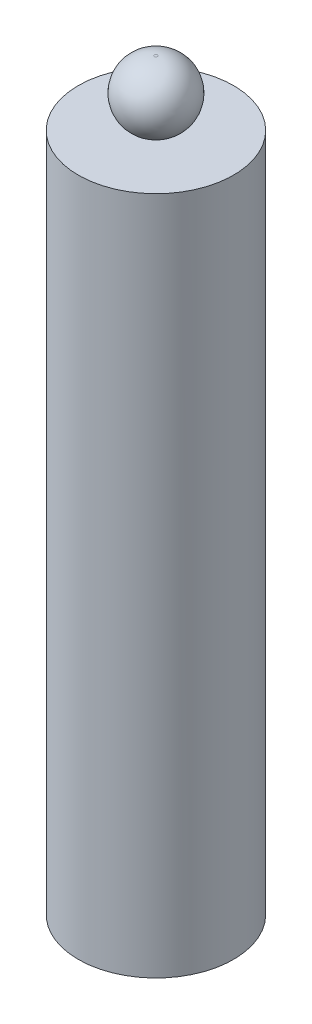
ISO-10303-21;
HEADER;
FILE_DESCRIPTION(('STEP AP214'),'2;1');
FILE_NAME('part.step','',(''),(''),'','','');
FILE_SCHEMA(('AUTOMOTIVE_DESIGN { 1 0 10303 214 1 1 1 1 }'));
ENDSEC;
DATA;
#1=APPLICATION_CONTEXT('core data for automotive mechanical design processes');
#2=APPLICATION_PROTOCOL_DEFINITION('international standard','automotive_design',2000,#1);
#3=PRODUCT_CONTEXT('',#1,'mechanical');
#4=PRODUCT('Part','Part','',(#3));
#5=PRODUCT_RELATED_PRODUCT_CATEGORY('part','',(#4));
#6=PRODUCT_DEFINITION_FORMATION('','',#4);
#7=PRODUCT_DEFINITION_CONTEXT('part definition',#1,'design');
#8=PRODUCT_DEFINITION('design','',#6,#7);
#9=PRODUCT_DEFINITION_SHAPE('','',#8);
#10=(LENGTH_UNIT() NAMED_UNIT(*) SI_UNIT(.MILLI.,.METRE.));
#11=(NAMED_UNIT(*) PLANE_ANGLE_UNIT() SI_UNIT($,.RADIAN.));
#12=(NAMED_UNIT(*) SI_UNIT($,.STERADIAN.) SOLID_ANGLE_UNIT());
#13=UNCERTAINTY_MEASURE_WITH_UNIT(LENGTH_MEASURE(1.E-05),#10,'distance_accuracy_value','');
#14=(GEOMETRIC_REPRESENTATION_CONTEXT(3) GLOBAL_UNCERTAINTY_ASSIGNED_CONTEXT((#13)) GLOBAL_UNIT_ASSIGNED_CONTEXT((#10,
#11,#12)) REPRESENTATION_CONTEXT('',''));
#15=CARTESIAN_POINT('',(0.,0.,0.));
#16=DIRECTION('',(0.,0.,1.));
#17=DIRECTION('',(1.,0.,0.));
#18=AXIS2_PLACEMENT_3D('',#15,#16,#17);
#19=CARTESIAN_POINT('',(0.,230.,0.));
#20=DIRECTION('',(0.,-1.,0.));
#21=DIRECTION('',(0.,0.,-1.));
#22=AXIS2_PLACEMENT_3D('',#19,#20,#21);
#23=CYLINDRICAL_SURFACE('',#22,24.);
#24=CARTESIAN_POINT('',(0.,0.,0.));
#25=DIRECTION('',(0.,1.,0.));
#26=DIRECTION('',(0.,0.,1.));
#27=AXIS2_PLACEMENT_3D('',#24,#25,#26);
#28=CIRCLE('',#27,24.);
#29=CARTESIAN_POINT('',(0.,0.,24.));
#30=VERTEX_POINT('',#29);
#31=EDGE_CURVE('E10',#30,#30,#28,.T.);
#32=ORIENTED_EDGE('',*,*,#31,.T.);
#33=EDGE_LOOP('',(#32));
#34=FACE_BOUND('',#33,.T.);
#35=CARTESIAN_POINT('',(0.,210.,0.));
#36=DIRECTION('',(0.,1.,0.));
#37=DIRECTION('',(-1.,0.,0.));
#38=AXIS2_PLACEMENT_3D('',#35,#36,#37);
#39=CIRCLE('',#38,24.);
#40=CARTESIAN_POINT('',(-24.,210.,0.));
#41=VERTEX_POINT('',#40);
#42=EDGE_CURVE('E54',#41,#41,#39,.T.);
#43=ORIENTED_EDGE('',*,*,#42,.F.);
#44=EDGE_LOOP('',(#43));
#45=FACE_BOUND('',#44,.T.);
#46=ADVANCED_FACE('F43',(#34,#45),#23,.T.);
#47=CARTESIAN_POINT('',(0.,0.,0.));
#48=DIRECTION('',(0.,1.,0.));
#49=DIRECTION('',(0.,0.,1.));
#50=AXIS2_PLACEMENT_3D('',#47,#48,#49);
#51=PLANE('',#50);
#52=ORIENTED_EDGE('',*,*,#31,.F.);
#53=EDGE_LOOP('',(#52));
#54=FACE_BOUND('',#53,.T.);
#55=ADVANCED_FACE('F75',(#54),#51,.F.);
#56=CARTESIAN_POINT('',(0.,220.,0.));
#57=DIRECTION('',(0.,1.,0.));
#58=DIRECTION('',(-1.,0.,0.));
#59=AXIS2_PLACEMENT_3D('',#56,#57,#58);
#60=DEGENERATE_TOROIDAL_SURFACE('',#59,0.499999999999998,10.,.T.);
#61=CARTESIAN_POINT('',(0.,210.,0.));
#62=DIRECTION('',(0.,1.,0.));
#63=DIRECTION('',(-1.,0.,0.));
#64=AXIS2_PLACEMENT_3D('',#61,#62,#63);
#65=CIRCLE('',#64,0.499999999999998);
#66=CARTESIAN_POINT('',(-0.499999999999992,210.,0.));
#67=VERTEX_POINT('',#66);
#68=EDGE_CURVE('E49',#67,#67,#65,.T.);
#69=ORIENTED_EDGE('',*,*,#68,.T.);
#70=EDGE_LOOP('',(#69));
#71=FACE_BOUND('',#70,.T.);
#72=CARTESIAN_POINT('',(0.,230.,0.));
#73=DIRECTION('',(0.,1.,0.));
#74=DIRECTION('',(-1.,0.,0.));
#75=AXIS2_PLACEMENT_3D('',#72,#73,#74);
#76=CIRCLE('',#75,0.499999999999997);
#77=CARTESIAN_POINT('',(-0.499999999999991,230.,0.));
#78=VERTEX_POINT('',#77);
#79=EDGE_CURVE('E58',#78,#78,#76,.T.);
#80=ORIENTED_EDGE('',*,*,#79,.F.);
#81=EDGE_LOOP('',(#80));
#82=FACE_BOUND('',#81,.T.);
#83=ADVANCED_FACE('F67',(#71,#82),#60,.T.);
#84=CARTESIAN_POINT('',(24.,210.,0.));
#85=DIRECTION('',(0.,1.,0.));
#86=DIRECTION('',(-1.,0.,0.));
#87=AXIS2_PLACEMENT_3D('',#84,#85,#86);
#88=PLANE('',#87);
#89=ORIENTED_EDGE('',*,*,#42,.T.);
#90=EDGE_LOOP('',(#89));
#91=FACE_BOUND('',#90,.T.);
#92=ORIENTED_EDGE('',*,*,#68,.F.);
#93=EDGE_LOOP('',(#92));
#94=FACE_BOUND('',#93,.T.);
#95=ADVANCED_FACE('F72',(#91,#94),#88,.T.);
#96=CARTESIAN_POINT('',(0.,230.,0.));
#97=DIRECTION('',(0.,1.,0.));
#98=DIRECTION('',(0.,0.,1.));
#99=AXIS2_PLACEMENT_3D('',#96,#97,#98);
#100=PLANE('',#99);
#101=ORIENTED_EDGE('',*,*,#79,.T.);
#102=EDGE_LOOP('',(#101));
#103=FACE_BOUND('',#102,.T.);
#104=ADVANCED_FACE('F70',(#103),#100,.T.);
#105=CLOSED_SHELL('',(#46,#55,#83,#95,#104));
#106=MANIFOLD_SOLID_BREP('B2',#105);
#107=ADVANCED_BREP_SHAPE_REPRESENTATION('',(#18,#106),#14);
#108=SHAPE_DEFINITION_REPRESENTATION(#9,#107);
ENDSEC;
END-ISO-10303-21;
